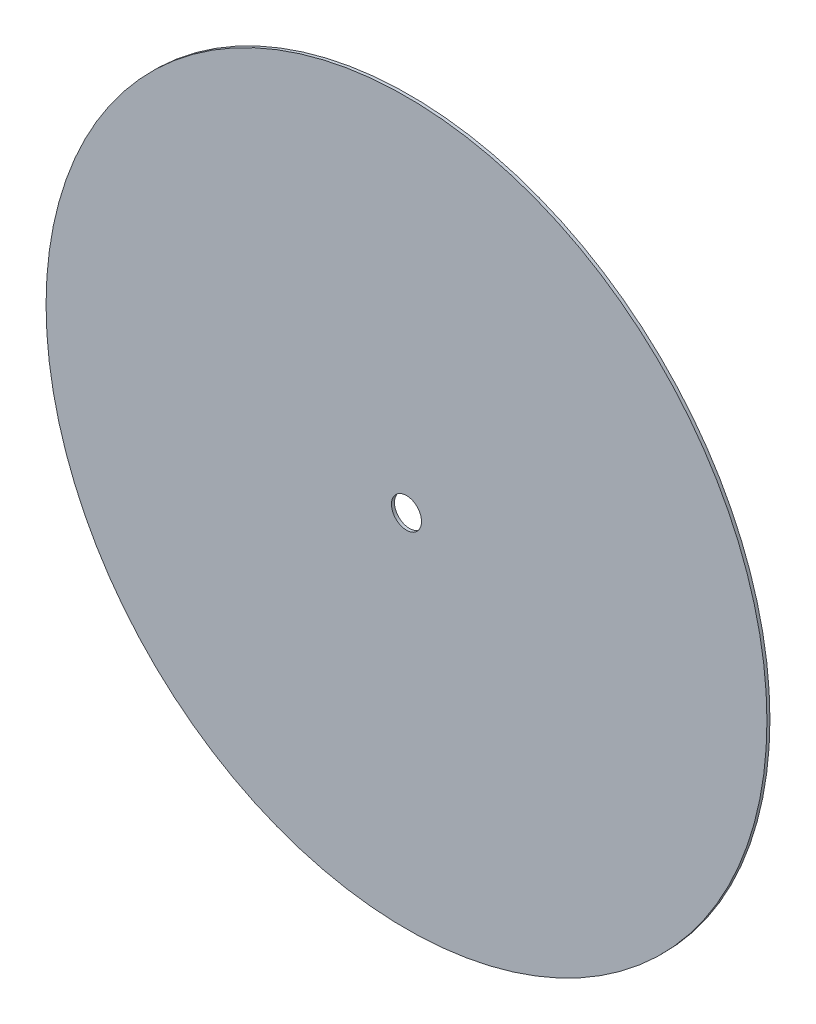
ISO-10303-21;
HEADER;
FILE_DESCRIPTION(('STEP AP214'),'2;1');
FILE_NAME('part.step','',(''),(''),'','','');
FILE_SCHEMA(('AUTOMOTIVE_DESIGN { 1 0 10303 214 1 1 1 1 }'));
ENDSEC;
DATA;
#1=APPLICATION_CONTEXT('core data for automotive mechanical design processes');
#2=APPLICATION_PROTOCOL_DEFINITION('international standard','automotive_design',2000,#1);
#3=PRODUCT_CONTEXT('',#1,'mechanical');
#4=PRODUCT('Part','Part','',(#3));
#5=PRODUCT_RELATED_PRODUCT_CATEGORY('part','',(#4));
#6=PRODUCT_DEFINITION_FORMATION('','',#4);
#7=PRODUCT_DEFINITION_CONTEXT('part definition',#1,'design');
#8=PRODUCT_DEFINITION('design','',#6,#7);
#9=PRODUCT_DEFINITION_SHAPE('','',#8);
#10=(LENGTH_UNIT() NAMED_UNIT(*) SI_UNIT(.MILLI.,.METRE.));
#11=(NAMED_UNIT(*) PLANE_ANGLE_UNIT() SI_UNIT($,.RADIAN.));
#12=(NAMED_UNIT(*) SI_UNIT($,.STERADIAN.) SOLID_ANGLE_UNIT());
#13=UNCERTAINTY_MEASURE_WITH_UNIT(LENGTH_MEASURE(1.E-05),#10,'distance_accuracy_value','');
#14=(GEOMETRIC_REPRESENTATION_CONTEXT(3) GLOBAL_UNCERTAINTY_ASSIGNED_CONTEXT((#13)) GLOBAL_UNIT_ASSIGNED_CONTEXT((#10,
#11,#12)) REPRESENTATION_CONTEXT('',''));
#15=CARTESIAN_POINT('',(0.,0.,0.));
#16=DIRECTION('',(0.,0.,1.));
#17=DIRECTION('',(1.,0.,0.));
#18=AXIS2_PLACEMENT_3D('',#15,#16,#17);
#19=CARTESIAN_POINT('',(0.,0.,1.27));
#20=DIRECTION('',(0.,0.,-1.));
#21=DIRECTION('',(-1.,0.,0.));
#22=AXIS2_PLACEMENT_3D('',#19,#20,#21);
#23=CYLINDRICAL_SURFACE('',#22,152.4);
#24=CARTESIAN_POINT('',(0.,0.,1.27));
#25=DIRECTION('',(0.,0.,1.));
#26=DIRECTION('',(1.,0.,0.));
#27=AXIS2_PLACEMENT_3D('',#24,#25,#26);
#28=CIRCLE('',#27,152.4);
#29=CARTESIAN_POINT('',(152.4,0.,1.27));
#30=VERTEX_POINT('',#29);
#31=EDGE_CURVE('E10',#30,#30,#28,.T.);
#32=ORIENTED_EDGE('',*,*,#31,.F.);
#33=EDGE_LOOP('',(#32));
#34=FACE_BOUND('',#33,.T.);
#35=CARTESIAN_POINT('',(0.,0.,0.));
#36=DIRECTION('',(0.,0.,1.));
#37=DIRECTION('',(1.,0.,0.));
#38=AXIS2_PLACEMENT_3D('',#35,#36,#37);
#39=CIRCLE('',#38,152.4);
#40=CARTESIAN_POINT('',(152.4,0.,0.));
#41=VERTEX_POINT('',#40);
#42=EDGE_CURVE('E40',#41,#41,#39,.T.);
#43=ORIENTED_EDGE('',*,*,#42,.T.);
#44=EDGE_LOOP('',(#43));
#45=FACE_BOUND('',#44,.T.);
#46=ADVANCED_FACE('F37',(#34,#45),#23,.T.);
#47=CARTESIAN_POINT('',(0.,0.,1.27));
#48=DIRECTION('',(0.,0.,1.));
#49=DIRECTION('',(1.,0.,0.));
#50=AXIS2_PLACEMENT_3D('',#47,#48,#49);
#51=PLANE('',#50);
#52=CARTESIAN_POINT('',(0.,0.,1.27));
#53=DIRECTION('',(0.,0.,1.));
#54=DIRECTION('',(1.,0.,0.));
#55=AXIS2_PLACEMENT_3D('',#52,#53,#54);
#56=CIRCLE('',#55,6.35);
#57=CARTESIAN_POINT('',(6.35,0.,1.27));
#58=VERTEX_POINT('',#57);
#59=EDGE_CURVE('E51',#58,#58,#56,.T.);
#60=ORIENTED_EDGE('',*,*,#59,.F.);
#61=EDGE_LOOP('',(#60));
#62=FACE_BOUND('',#61,.T.);
#63=ORIENTED_EDGE('',*,*,#31,.T.);
#64=EDGE_LOOP('',(#63));
#65=FACE_BOUND('',#64,.T.);
#66=ADVANCED_FACE('F68',(#62,#65),#51,.T.);
#67=CARTESIAN_POINT('',(0.,0.,0.));
#68=DIRECTION('',(0.,0.,1.));
#69=DIRECTION('',(1.,0.,0.));
#70=AXIS2_PLACEMENT_3D('',#67,#68,#69);
#71=PLANE('',#70);
#72=CARTESIAN_POINT('',(0.,0.,0.));
#73=DIRECTION('',(0.,0.,1.));
#74=DIRECTION('',(1.,0.,0.));
#75=AXIS2_PLACEMENT_3D('',#72,#73,#74);
#76=CIRCLE('',#75,6.35);
#77=CARTESIAN_POINT('',(6.35,0.,0.));
#78=VERTEX_POINT('',#77);
#79=EDGE_CURVE('E49',#78,#78,#76,.T.);
#80=ORIENTED_EDGE('',*,*,#79,.T.);
#81=EDGE_LOOP('',(#80));
#82=FACE_BOUND('',#81,.T.);
#83=ORIENTED_EDGE('',*,*,#42,.F.);
#84=EDGE_LOOP('',(#83));
#85=FACE_BOUND('',#84,.T.);
#86=ADVANCED_FACE('F59',(#82,#85),#71,.F.);
#87=CARTESIAN_POINT('',(0.,0.,0.));
#88=DIRECTION('',(0.,0.,1.));
#89=DIRECTION('',(1.,0.,0.));
#90=AXIS2_PLACEMENT_3D('',#87,#88,#89);
#91=CYLINDRICAL_SURFACE('',#90,6.35);
#92=ORIENTED_EDGE('',*,*,#79,.F.);
#93=EDGE_LOOP('',(#92));
#94=FACE_BOUND('',#93,.T.);
#95=ORIENTED_EDGE('',*,*,#59,.T.);
#96=EDGE_LOOP('',(#95));
#97=FACE_BOUND('',#96,.T.);
#98=ADVANCED_FACE('F62',(#94,#97),#91,.F.);
#99=CLOSED_SHELL('',(#46,#66,#86,#98));
#100=MANIFOLD_SOLID_BREP('B2',#99);
#101=ADVANCED_BREP_SHAPE_REPRESENTATION('',(#18,#100),#14);
#102=SHAPE_DEFINITION_REPRESENTATION(#9,#101);
ENDSEC;
END-ISO-10303-21;
